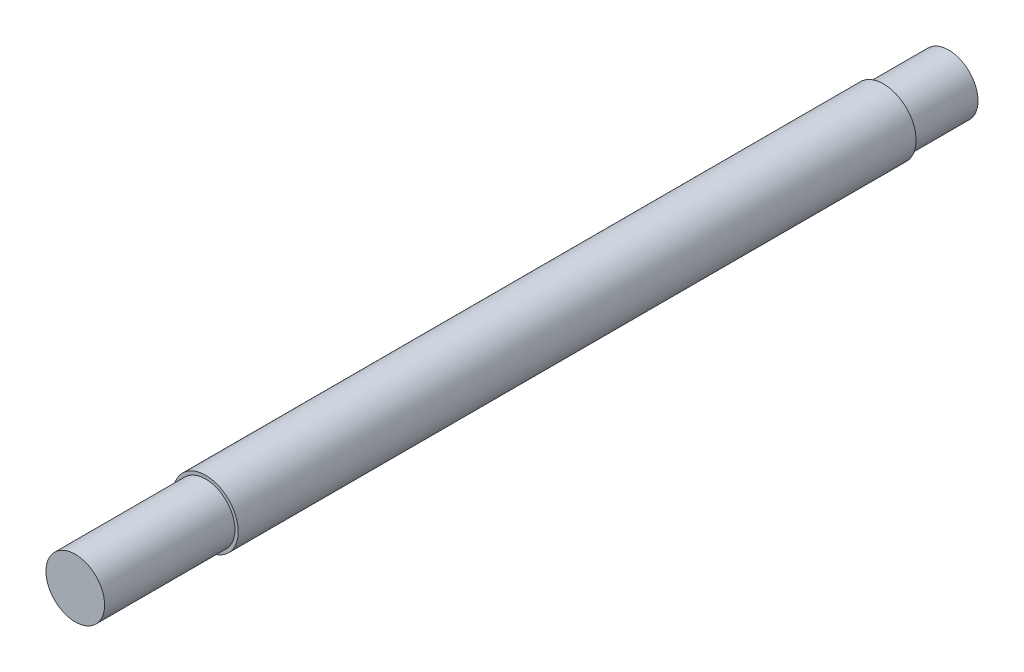
ISO-10303-21;
HEADER;
FILE_DESCRIPTION(('STEP AP214'),'2;1');
FILE_NAME('part.step','',(''),(''),'','','');
FILE_SCHEMA(('AUTOMOTIVE_DESIGN { 1 0 10303 214 1 1 1 1 }'));
ENDSEC;
DATA;
#1=APPLICATION_CONTEXT('core data for automotive mechanical design processes');
#2=APPLICATION_PROTOCOL_DEFINITION('international standard','automotive_design',2000,#1);
#3=PRODUCT_CONTEXT('',#1,'mechanical');
#4=PRODUCT('Part','Part','',(#3));
#5=PRODUCT_RELATED_PRODUCT_CATEGORY('part','',(#4));
#6=PRODUCT_DEFINITION_FORMATION('','',#4);
#7=PRODUCT_DEFINITION_CONTEXT('part definition',#1,'design');
#8=PRODUCT_DEFINITION('design','',#6,#7);
#9=PRODUCT_DEFINITION_SHAPE('','',#8);
#10=(LENGTH_UNIT() NAMED_UNIT(*) SI_UNIT(.MILLI.,.METRE.));
#11=(NAMED_UNIT(*) PLANE_ANGLE_UNIT() SI_UNIT($,.RADIAN.));
#12=(NAMED_UNIT(*) SI_UNIT($,.STERADIAN.) SOLID_ANGLE_UNIT());
#13=UNCERTAINTY_MEASURE_WITH_UNIT(LENGTH_MEASURE(1.E-05),#10,'distance_accuracy_value','');
#14=(GEOMETRIC_REPRESENTATION_CONTEXT(3) GLOBAL_UNCERTAINTY_ASSIGNED_CONTEXT((#13)) GLOBAL_UNIT_ASSIGNED_CONTEXT((#10,
#11,#12)) REPRESENTATION_CONTEXT('',''));
#15=CARTESIAN_POINT('',(0.,0.,0.));
#16=DIRECTION('',(0.,0.,1.));
#17=DIRECTION('',(1.,0.,0.));
#18=AXIS2_PLACEMENT_3D('',#15,#16,#17);
#19=CARTESIAN_POINT('',(0.,0.,52.));
#20=DIRECTION('',(0.,0.,1.));
#21=DIRECTION('',(1.,0.,0.));
#22=AXIS2_PLACEMENT_3D('',#19,#20,#21);
#23=PLANE('',#22);
#24=CARTESIAN_POINT('',(0.,0.,52.));
#25=DIRECTION('',(0.,0.,1.));
#26=DIRECTION('',(1.,0.,0.));
#27=AXIS2_PLACEMENT_3D('',#24,#25,#26);
#28=CIRCLE('',#27,5.);
#29=CARTESIAN_POINT('',(-5.,0.,52.));
#30=VERTEX_POINT('',#29);
#31=EDGE_CURVE('E47',#30,#30,#28,.T.);
#32=ORIENTED_EDGE('',*,*,#31,.T.);
#33=EDGE_LOOP('',(#32));
#34=FACE_BOUND('',#33,.T.);
#35=CARTESIAN_POINT('',(0.,0.,52.));
#36=DIRECTION('',(0.,0.,1.));
#37=DIRECTION('',(1.,0.,0.));
#38=AXIS2_PLACEMENT_3D('',#35,#36,#37);
#39=CIRCLE('',#38,4.5);
#40=CARTESIAN_POINT('',(4.5,0.,52.));
#41=VERTEX_POINT('',#40);
#42=EDGE_CURVE('E65',#41,#41,#39,.T.);
#43=ORIENTED_EDGE('',*,*,#42,.F.);
#44=EDGE_LOOP('',(#43));
#45=FACE_BOUND('',#44,.T.);
#46=ADVANCED_FACE('F39',(#34,#45),#23,.T.);
#47=CARTESIAN_POINT('',(0.,0.,-52.));
#48=DIRECTION('',(0.,0.,1.));
#49=DIRECTION('',(1.,0.,0.));
#50=AXIS2_PLACEMENT_3D('',#47,#48,#49);
#51=PLANE('',#50);
#52=CARTESIAN_POINT('',(0.,0.,-52.));
#53=DIRECTION('',(0.,0.,1.));
#54=DIRECTION('',(1.,0.,0.));
#55=AXIS2_PLACEMENT_3D('',#52,#53,#54);
#56=CIRCLE('',#55,5.);
#57=CARTESIAN_POINT('',(-5.,0.,-52.));
#58=VERTEX_POINT('',#57);
#59=EDGE_CURVE('E53',#58,#58,#56,.T.);
#60=ORIENTED_EDGE('',*,*,#59,.F.);
#61=EDGE_LOOP('',(#60));
#62=FACE_BOUND('',#61,.T.);
#63=CARTESIAN_POINT('',(0.,0.,-52.));
#64=DIRECTION('',(0.,0.,1.));
#65=DIRECTION('',(1.,0.,0.));
#66=AXIS2_PLACEMENT_3D('',#63,#64,#65);
#67=CIRCLE('',#66,4.5);
#68=CARTESIAN_POINT('',(4.5,0.,-52.));
#69=VERTEX_POINT('',#68);
#70=EDGE_CURVE('E10',#69,#69,#67,.F.);
#71=ORIENTED_EDGE('',*,*,#70,.F.);
#72=EDGE_LOOP('',(#71));
#73=FACE_BOUND('',#72,.T.);
#74=ADVANCED_FACE('F81',(#62,#73),#51,.F.);
#75=CARTESIAN_POINT('',(0.,0.,52.));
#76=DIRECTION('',(0.,0.,-1.));
#77=DIRECTION('',(-1.,0.,0.));
#78=AXIS2_PLACEMENT_3D('',#75,#76,#77);
#79=CYLINDRICAL_SURFACE('',#78,5.);
#80=CARTESIAN_POINT('',(-5.,0.,52.));
#81=CARTESIAN_POINT('',(-5.,0.,50.9166666666667));
#82=CARTESIAN_POINT('',(-5.,0.,49.8333333333333));
#83=CARTESIAN_POINT('',(-5.,0.,47.6666666666667));
#84=CARTESIAN_POINT('',(-5.,0.,46.5833333333333));
#85=CARTESIAN_POINT('',(-5.,0.,44.4166666666667));
#86=CARTESIAN_POINT('',(-5.,0.,43.3333333333333));
#87=CARTESIAN_POINT('',(-5.,0.,41.1666666666667));
#88=CARTESIAN_POINT('',(-5.,0.,40.0833333333333));
#89=CARTESIAN_POINT('',(-5.,0.,37.9166666666667));
#90=CARTESIAN_POINT('',(-5.,0.,36.8333333333333));
#91=CARTESIAN_POINT('',(-5.,0.,34.6666666666667));
#92=CARTESIAN_POINT('',(-5.,0.,33.5833333333333));
#93=CARTESIAN_POINT('',(-5.,0.,31.4166666666667));
#94=CARTESIAN_POINT('',(-5.,0.,30.3333333333333));
#95=CARTESIAN_POINT('',(-5.,0.,28.1666666666667));
#96=CARTESIAN_POINT('',(-5.,0.,27.0833333333333));
#97=CARTESIAN_POINT('',(-5.,0.,24.9166666666667));
#98=CARTESIAN_POINT('',(-5.,0.,23.8333333333333));
#99=CARTESIAN_POINT('',(-5.,0.,21.6666666666667));
#100=CARTESIAN_POINT('',(-5.,0.,20.5833333333333));
#101=CARTESIAN_POINT('',(-5.,0.,18.4166666666667));
#102=CARTESIAN_POINT('',(-5.,0.,17.3333333333333));
#103=CARTESIAN_POINT('',(-5.,0.,15.1666666666667));
#104=CARTESIAN_POINT('',(-5.,0.,14.0833333333333));
#105=CARTESIAN_POINT('',(-5.,0.,11.9166666666667));
#106=CARTESIAN_POINT('',(-5.,0.,10.8333333333333));
#107=CARTESIAN_POINT('',(-5.,0.,8.66666666666667));
#108=CARTESIAN_POINT('',(-5.,0.,7.58333333333333));
#109=CARTESIAN_POINT('',(-5.,0.,5.41666666666667));
#110=CARTESIAN_POINT('',(-5.,0.,4.33333333333333));
#111=CARTESIAN_POINT('',(-5.,0.,2.16666666666667));
#112=CARTESIAN_POINT('',(-5.,0.,1.08333333333333));
#113=CARTESIAN_POINT('',(-5.,0.,-1.08333333333333));
#114=CARTESIAN_POINT('',(-5.,0.,-2.16666666666667));
#115=CARTESIAN_POINT('',(-5.,0.,-4.33333333333333));
#116=CARTESIAN_POINT('',(-5.,0.,-5.41666666666667));
#117=CARTESIAN_POINT('',(-5.,0.,-7.58333333333333));
#118=CARTESIAN_POINT('',(-5.,0.,-8.66666666666667));
#119=CARTESIAN_POINT('',(-5.,0.,-10.8333333333333));
#120=CARTESIAN_POINT('',(-5.,0.,-11.9166666666667));
#121=CARTESIAN_POINT('',(-5.,0.,-14.0833333333333));
#122=CARTESIAN_POINT('',(-5.,0.,-15.1666666666667));
#123=CARTESIAN_POINT('',(-5.,0.,-17.3333333333333));
#124=CARTESIAN_POINT('',(-5.,0.,-18.4166666666667));
#125=CARTESIAN_POINT('',(-5.,0.,-20.5833333333333));
#126=CARTESIAN_POINT('',(-5.,0.,-21.6666666666667));
#127=CARTESIAN_POINT('',(-5.,0.,-23.8333333333333));
#128=CARTESIAN_POINT('',(-5.,0.,-24.9166666666667));
#129=CARTESIAN_POINT('',(-5.,0.,-27.0833333333333));
#130=CARTESIAN_POINT('',(-5.,0.,-28.1666666666667));
#131=CARTESIAN_POINT('',(-5.,0.,-30.3333333333333));
#132=CARTESIAN_POINT('',(-5.,0.,-31.4166666666667));
#133=CARTESIAN_POINT('',(-5.,0.,-33.5833333333333));
#134=CARTESIAN_POINT('',(-5.,0.,-34.6666666666667));
#135=CARTESIAN_POINT('',(-5.,0.,-36.8333333333333));
#136=CARTESIAN_POINT('',(-5.,0.,-37.9166666666667));
#137=CARTESIAN_POINT('',(-5.,0.,-40.0833333333333));
#138=CARTESIAN_POINT('',(-5.,0.,-41.1666666666667));
#139=CARTESIAN_POINT('',(-5.,0.,-43.3333333333333));
#140=CARTESIAN_POINT('',(-5.,0.,-44.4166666666667));
#141=CARTESIAN_POINT('',(-5.,0.,-46.5833333333333));
#142=CARTESIAN_POINT('',(-5.,0.,-47.6666666666667));
#143=CARTESIAN_POINT('',(-5.,0.,-49.8333333333333));
#144=CARTESIAN_POINT('',(-5.,0.,-50.9166666666667));
#145=CARTESIAN_POINT('',(-5.,0.,-52.));
#146=B_SPLINE_CURVE_WITH_KNOTS('',3,(#80,#81,#82,#83,#84,#85,#86,#87,#88,#89,#90,#91,#92,#93,
#94,#95,#96,#97,#98,#99,#100,#101,#102,#103,#104,#105,#106,#107,#108,#109,#110,#111,#112,#113,
#114,#115,#116,#117,#118,#119,#120,#121,#122,#123,#124,#125,#126,#127,#128,#129,#130,#131,#132,
#133,#134,#135,#136,#137,#138,#139,#140,#141,#142,#143,#144,#145),.UNSPECIFIED.,.F.,.F.,(4,2,2,
2,2,2,2,2,2,2,2,2,2,2,2,2,2,2,2,2,2,2,2,2,2,2,2,2,2,2,2,2,4),(0.,3.25,6.50000000000001,9.75,13.,
16.25,19.5,22.75,26.,29.25,32.5,35.75,39.,42.25,45.5,48.75,52.,55.25,58.5,61.75,65.,68.25,71.5,
74.75,78.,81.25,84.5,87.75,91.,94.25,97.5,100.75,104.),.UNSPECIFIED.);
#147=EDGE_CURVE('BSEAM41',#30,#58,#146,.T.);
#148=ORIENTED_EDGE('',*,*,#31,.F.);
#149=ORIENTED_EDGE('',*,*,#59,.T.);
#150=ORIENTED_EDGE('',*,*,#147,.T.);
#151=ORIENTED_EDGE('',*,*,#147,.F.);
#152=EDGE_LOOP('',(#148,#150,#149,#151));
#153=FACE_BOUND('',#152,.T.);
#154=ADVANCED_FACE('F41',(#153),#79,.T.);
#155=CARTESIAN_POINT('',(0.,0.,-62.));
#156=DIRECTION('',(0.,0.,1.));
#157=DIRECTION('',(1.,0.,0.));
#158=AXIS2_PLACEMENT_3D('',#155,#156,#157);
#159=CYLINDRICAL_SURFACE('',#158,4.5);
#160=CARTESIAN_POINT('',(0.,0.,-62.));
#161=DIRECTION('',(0.,0.,-1.));
#162=DIRECTION('',(-1.,0.,0.));
#163=AXIS2_PLACEMENT_3D('',#160,#161,#162);
#164=CIRCLE('',#163,4.5);
#165=CARTESIAN_POINT('',(-4.5,0.,-62.));
#166=VERTEX_POINT('',#165);
#167=EDGE_CURVE('E60',#166,#166,#164,.T.);
#168=ORIENTED_EDGE('',*,*,#167,.F.);
#169=EDGE_LOOP('',(#168));
#170=FACE_BOUND('',#169,.T.);
#171=ORIENTED_EDGE('',*,*,#70,.T.);
#172=EDGE_LOOP('',(#171));
#173=FACE_BOUND('',#172,.T.);
#174=ADVANCED_FACE('F88',(#170,#173),#159,.T.);
#175=CARTESIAN_POINT('',(0.,0.,-62.));
#176=DIRECTION('',(0.,0.,-1.));
#177=DIRECTION('',(-1.,0.,0.));
#178=AXIS2_PLACEMENT_3D('',#175,#176,#177);
#179=PLANE('',#178);
#180=ORIENTED_EDGE('',*,*,#167,.T.);
#181=EDGE_LOOP('',(#180));
#182=FACE_BOUND('',#181,.T.);
#183=ADVANCED_FACE('F76',(#182),#179,.T.);
#184=CARTESIAN_POINT('',(0.,0.,72.));
#185=DIRECTION('',(0.,0.,-1.));
#186=DIRECTION('',(-1.,0.,0.));
#187=AXIS2_PLACEMENT_3D('',#184,#185,#186);
#188=CYLINDRICAL_SURFACE('',#187,4.5);
#189=CARTESIAN_POINT('',(0.,0.,72.));
#190=DIRECTION('',(0.,0.,1.));
#191=DIRECTION('',(1.,0.,0.));
#192=AXIS2_PLACEMENT_3D('',#189,#190,#191);
#193=CIRCLE('',#192,4.5);
#194=CARTESIAN_POINT('',(4.5,0.,72.));
#195=VERTEX_POINT('',#194);
#196=EDGE_CURVE('E64',#195,#195,#193,.T.);
#197=ORIENTED_EDGE('',*,*,#196,.F.);
#198=EDGE_LOOP('',(#197));
#199=FACE_BOUND('',#198,.T.);
#200=ORIENTED_EDGE('',*,*,#42,.T.);
#201=EDGE_LOOP('',(#200));
#202=FACE_BOUND('',#201,.T.);
#203=ADVANCED_FACE('F73',(#199,#202),#188,.T.);
#204=CARTESIAN_POINT('',(0.,0.,72.));
#205=DIRECTION('',(0.,0.,1.));
#206=DIRECTION('',(1.,0.,0.));
#207=AXIS2_PLACEMENT_3D('',#204,#205,#206);
#208=PLANE('',#207);
#209=ORIENTED_EDGE('',*,*,#196,.T.);
#210=EDGE_LOOP('',(#209));
#211=FACE_BOUND('',#210,.T.);
#212=ADVANCED_FACE('F71',(#211),#208,.T.);
#213=CLOSED_SHELL('',(#46,#74,#154,#174,#183,#203,#212));
#214=MANIFOLD_SOLID_BREP('B2',#213);
#215=ADVANCED_BREP_SHAPE_REPRESENTATION('',(#18,#214),#14);
#216=SHAPE_DEFINITION_REPRESENTATION(#9,#215);
ENDSEC;
END-ISO-10303-21;
